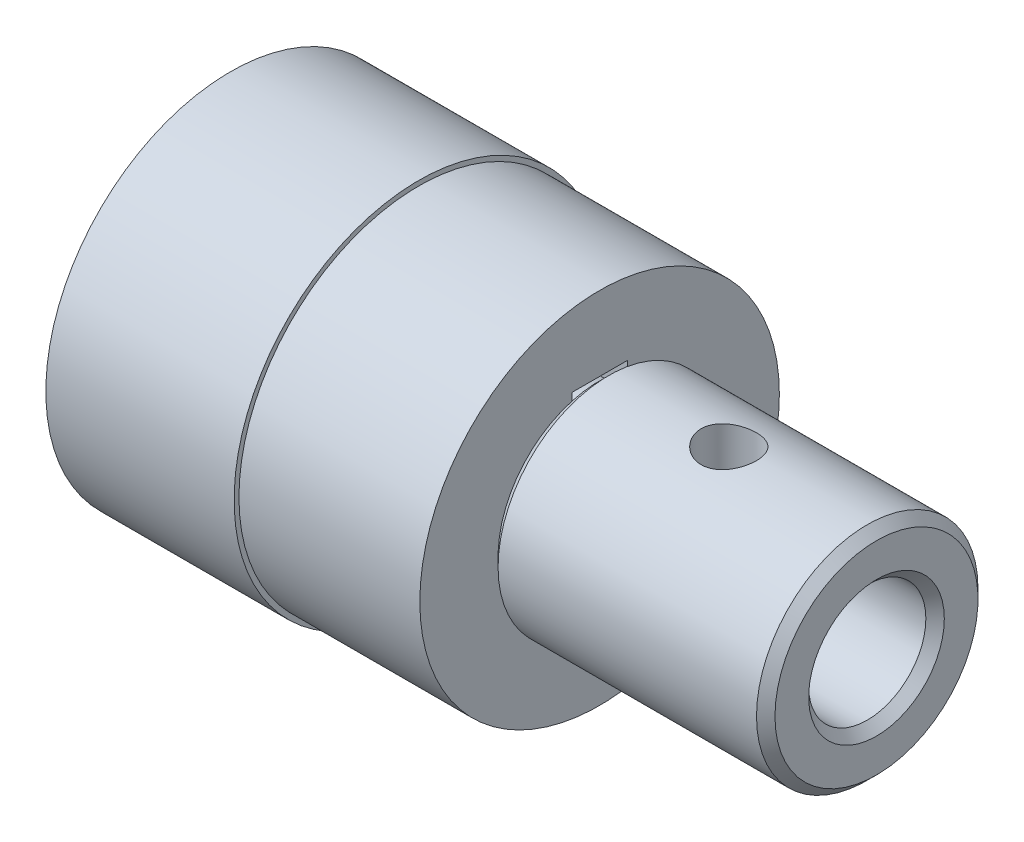
ISO-10303-21;
HEADER;
FILE_DESCRIPTION(('STEP AP214'),'2;1');
FILE_NAME('part.step','',(''),(''),'','','');
FILE_SCHEMA(('AUTOMOTIVE_DESIGN { 1 0 10303 214 1 1 1 1 }'));
ENDSEC;
DATA;
#1=APPLICATION_CONTEXT('core data for automotive mechanical design processes');
#2=APPLICATION_PROTOCOL_DEFINITION('international standard','automotive_design',2000,#1);
#3=PRODUCT_CONTEXT('',#1,'mechanical');
#4=PRODUCT('Part','Part','',(#3));
#5=PRODUCT_RELATED_PRODUCT_CATEGORY('part','',(#4));
#6=PRODUCT_DEFINITION_FORMATION('','',#4);
#7=PRODUCT_DEFINITION_CONTEXT('part definition',#1,'design');
#8=PRODUCT_DEFINITION('design','',#6,#7);
#9=PRODUCT_DEFINITION_SHAPE('','',#8);
#10=(LENGTH_UNIT() NAMED_UNIT(*) SI_UNIT(.MILLI.,.METRE.));
#11=(NAMED_UNIT(*) PLANE_ANGLE_UNIT() SI_UNIT($,.RADIAN.));
#12=(NAMED_UNIT(*) SI_UNIT($,.STERADIAN.) SOLID_ANGLE_UNIT());
#13=UNCERTAINTY_MEASURE_WITH_UNIT(LENGTH_MEASURE(1.E-05),#10,'distance_accuracy_value','');
#14=(GEOMETRIC_REPRESENTATION_CONTEXT(3) GLOBAL_UNCERTAINTY_ASSIGNED_CONTEXT((#13)) GLOBAL_UNIT_ASSIGNED_CONTEXT((#10,
#11,#12)) REPRESENTATION_CONTEXT('',''));
#15=CARTESIAN_POINT('',(0.,0.,0.));
#16=DIRECTION('',(0.,0.,1.));
#17=DIRECTION('',(1.,0.,0.));
#18=AXIS2_PLACEMENT_3D('',#15,#16,#17);
#19=CARTESIAN_POINT('',(-32.1530426464847,11.6343589680811,14.4976802298514));
#20=DIRECTION('',(1.,0.,0.));
#21=DIRECTION('',(0.,0.,-1.));
#22=AXIS2_PLACEMENT_3D('',#19,#20,#21);
#23=CONICAL_SURFACE('',#22,3.6750000000437,0.785398163397448);
#24=CARTESIAN_POINT('',(-32.6530426464571,11.6343589680811,14.4976802298514));
#25=DIRECTION('',(-1.,0.,0.));
#26=DIRECTION('',(0.,0.,1.));
#27=AXIS2_PLACEMENT_3D('',#24,#25,#26);
#28=CIRCLE('',#27,3.175);
#29=CARTESIAN_POINT('',(-32.6530426464571,11.6343589680811,17.6726802298514));
#30=VERTEX_POINT('',#29);
#31=EDGE_CURVE('E188',#30,#30,#28,.T.);
#32=ORIENTED_EDGE('',*,*,#31,.T.);
#33=EDGE_LOOP('',(#32));
#34=FACE_BOUND('',#33,.T.);
#35=CARTESIAN_POINT('',(-32.1530426464847,11.6343589680811,14.4976802298514));
#36=DIRECTION('',(1.,0.,0.));
#37=DIRECTION('',(0.,0.,-1.));
#38=AXIS2_PLACEMENT_3D('',#35,#36,#37);
#39=CIRCLE('',#38,3.6750000000437);
#40=CARTESIAN_POINT('',(-32.1530426464847,11.6343589680811,10.8226802298077));
#41=VERTEX_POINT('',#40);
#42=EDGE_CURVE('E20',#41,#41,#39,.T.);
#43=ORIENTED_EDGE('',*,*,#42,.T.);
#44=EDGE_LOOP('',(#43));
#45=FACE_BOUND('',#44,.T.);
#46=ADVANCED_FACE('F17',(#34,#45),#23,.F.);
#47=CARTESIAN_POINT('',(-50.1530426464463,11.6343589680811,14.4976802298514));
#48=DIRECTION('',(1.,0.,0.));
#49=DIRECTION('',(0.,0.,-1.));
#50=AXIS2_PLACEMENT_3D('',#47,#48,#49);
#51=CONICAL_SURFACE('',#50,3.17499999999357,1.04719755119662);
#52=CARTESIAN_POINT('',(-51.9861297511195,11.6343589680811,14.4976802298513));
#53=VERTEX_POINT('',#52);
#54=VERTEX_LOOP('',#53);
#55=FACE_BOUND('',#54,.T.);
#56=CARTESIAN_POINT('',(-50.1530426464571,11.6343589680811,14.4976802298514));
#57=DIRECTION('',(-1.,0.,0.));
#58=DIRECTION('',(0.,0.,1.));
#59=AXIS2_PLACEMENT_3D('',#56,#57,#58);
#60=CIRCLE('',#59,3.175);
#61=CARTESIAN_POINT('',(-50.1530426464571,11.6343589680811,17.6726802298514));
#62=VERTEX_POINT('',#61);
#63=EDGE_CURVE('E184',#62,#62,#60,.F.);
#64=ORIENTED_EDGE('',*,*,#63,.T.);
#65=EDGE_LOOP('',(#64));
#66=FACE_BOUND('',#65,.T.);
#67=ADVANCED_FACE('F279',(#55,#66),#51,.F.);
#68=CARTESIAN_POINT('',(-32.1530426464571,17.6343589680811,14.4976802298514));
#69=DIRECTION('',(-1.,0.,0.));
#70=DIRECTION('',(0.,0.,1.));
#71=AXIS2_PLACEMENT_3D('',#68,#69,#70);
#72=PLANE('',#71);
#73=ORIENTED_EDGE('',*,*,#42,.F.);
#74=EDGE_LOOP('',(#73));
#75=FACE_BOUND('',#74,.T.);
#76=CARTESIAN_POINT('',(-32.1530426464847,11.6343589680811,14.4976802298514));
#77=DIRECTION('',(-1.,0.,0.));
#78=DIRECTION('',(0.,0.,1.));
#79=AXIS2_PLACEMENT_3D('',#76,#77,#78);
#80=CIRCLE('',#79,5.49999999998377);
#81=CARTESIAN_POINT('',(-32.1530426464847,11.6343589680811,19.9976802298352));
#82=VERTEX_POINT('',#81);
#83=EDGE_CURVE('E187',#82,#82,#80,.T.);
#84=ORIENTED_EDGE('',*,*,#83,.F.);
#85=EDGE_LOOP('',(#84));
#86=FACE_BOUND('',#85,.T.);
#87=ADVANCED_FACE('F276',(#75,#86),#72,.F.);
#88=CARTESIAN_POINT('',(-104.589647703624,11.6343589680811,14.4976802298514));
#89=DIRECTION('',(-1.,0.,0.));
#90=DIRECTION('',(0.,0.,1.));
#91=AXIS2_PLACEMENT_3D('',#88,#89,#90);
#92=CYLINDRICAL_SURFACE('',#91,3.175);
#93=CARTESIAN_POINT('',(-38.6549989871894,14.8084352186503,14.421094269808));
#94=CARTESIAN_POINT('',(-38.6591005159779,14.8064978774693,14.3409506354571));
#95=CARTESIAN_POINT('',(-38.6696655257545,14.8015038648331,14.2610950891726));
#96=CARTESIAN_POINT('',(-38.7032621922794,14.7859096161153,14.1045140267677));
#97=CARTESIAN_POINT('',(-38.7263234491977,14.7752960702784,14.0277964094547));
#98=CARTESIAN_POINT('',(-38.7838502368912,14.749588558509,13.8799619146142));
#99=CARTESIAN_POINT('',(-38.8182683435264,14.7345132506148,13.8088232440998));
#100=CARTESIAN_POINT('',(-38.8973866682666,14.7012809005847,13.6733713434811));
#101=CARTESIAN_POINT('',(-38.9420850463091,14.6831244101011,13.6090568949182));
#102=CARTESIAN_POINT('',(-39.0436674742159,14.6441772311903,13.4847046564924));
#103=CARTESIAN_POINT('',(-39.1011288044887,14.6232933997664,13.4251675560727));
#104=CARTESIAN_POINT('',(-39.2251530792043,14.5819320572085,13.3162234125197));
#105=CARTESIAN_POINT('',(-39.2917217411498,14.5614548106466,13.2668227820645));
#106=CARTESIAN_POINT('',(-39.4362530196415,14.5221510786825,13.1771489585295));
#107=CARTESIAN_POINT('',(-39.5146223414325,14.5034610405408,13.1374659545164));
#108=CARTESIAN_POINT('',(-39.6780463909101,14.4715863975076,13.0721623581435));
#109=CARTESIAN_POINT('',(-39.7630945865788,14.4583964911802,13.0465282169185));
#110=CARTESIAN_POINT('',(-39.9303991354037,14.4403944248839,13.0120346677264));
#111=CARTESIAN_POINT('',(-40.012353814898,14.4350078413076,13.0020203491948));
#112=CARTESIAN_POINT('',(-40.1769291432068,14.4315795798184,12.995614768941));
#113=CARTESIAN_POINT('',(-40.2595494233553,14.4335340820411,12.9992164222834));
#114=CARTESIAN_POINT('',(-40.4151967361039,14.4439592594769,13.0188731136786));
#115=CARTESIAN_POINT('',(-40.4884159492386,14.451825076443,13.0337732687746));
#116=CARTESIAN_POINT('',(-40.6312145342669,14.4723641731839,13.0740026944023));
#117=CARTESIAN_POINT('',(-40.7007928480052,14.4850388418225,13.0993349780599));
#118=CARTESIAN_POINT('',(-40.8381898076123,14.5145188783892,13.1610707261204));
#119=CARTESIAN_POINT('',(-40.905752407054,14.5314971460858,13.1979586142299));
#120=CARTESIAN_POINT('',(-41.0341108446635,14.5674635304472,13.2812997833373));
#121=CARTESIAN_POINT('',(-41.0949032326061,14.5864526623563,13.3277579074493));
#122=CARTESIAN_POINT('',(-41.2149348308601,14.6267997508178,13.4348813698128));
#123=CARTESIAN_POINT('',(-41.2732765437025,14.6481895886624,13.4965449482816));
#124=CARTESIAN_POINT('',(-41.3790075900644,14.6890659803567,13.629229728679));
#125=CARTESIAN_POINT('',(-41.4263946878216,14.7085521452121,13.700252836188));
#126=CARTESIAN_POINT('',(-41.5093067834218,14.7438039537282,13.8511131946576));
#127=CARTESIAN_POINT('',(-41.5446640107069,14.7595161434431,13.9310559650998));
#128=CARTESIAN_POINT('',(-41.6010963744458,14.7850487190069,14.0967067510995));
#129=CARTESIAN_POINT('',(-41.6221827378035,14.794873735602,14.1824101762518));
#130=CARTESIAN_POINT('',(-41.6478507993788,14.8068914559952,14.3491967308256));
#131=CARTESIAN_POINT('',(-41.6536944133791,14.8096671665461,14.4300445446639));
#132=CARTESIAN_POINT('',(-41.6522758383527,14.8089964203368,14.5915882660705));
#133=CARTESIAN_POINT('',(-41.6450171172735,14.8055516100343,14.6722842081775));
#134=CARTESIAN_POINT('',(-41.6184783219149,14.7931563626178,14.8268047414644));
#135=CARTESIAN_POINT('',(-41.5998502975035,14.784504888835,14.9007675444428));
#136=CARTESIAN_POINT('',(-41.5518978239434,14.7627715550111,15.0444366220627));
#137=CARTESIAN_POINT('',(-41.5225716661199,14.7496889872724,15.1141422146777));
#138=CARTESIAN_POINT('',(-41.4525606869017,14.7195378134896,15.2509629105562));
#139=CARTESIAN_POINT('',(-41.4114064635594,14.7023106585071,15.3178019342678));
#140=CARTESIAN_POINT('',(-41.3195367242308,14.6657872306725,15.4439288706233));
#141=CARTESIAN_POINT('',(-41.2688161619877,14.6464898681102,15.5032127701456));
#142=CARTESIAN_POINT('',(-41.1539604298228,14.6057772736466,15.6180983149854));
#143=CARTESIAN_POINT('',(-41.0890312351334,14.5843269773784,15.6728965018758));
#144=CARTESIAN_POINT('',(-40.9504308806693,14.5433239016454,15.7710155277899));
#145=CARTESIAN_POINT('',(-40.8767572139133,14.5237716692774,15.8143330638249));
#146=CARTESIAN_POINT('',(-40.7212742538128,14.4887798661514,15.8885864528566));
#147=CARTESIAN_POINT('',(-40.6393754292018,14.4733942823954,15.9193621603412));
#148=CARTESIAN_POINT('',(-40.4705760506415,14.4494107373767,15.9662922643768));
#149=CARTESIAN_POINT('',(-40.3836818371903,14.440804367006,15.9824647787559));
#150=CARTESIAN_POINT('',(-40.2171683306427,14.4323140776418,15.998393466366));
#151=CARTESIAN_POINT('',(-40.1377357278039,14.4316139121696,15.9996861557157));
#152=CARTESIAN_POINT('',(-39.979891894367,14.4369269045302,15.9897490703616));
#153=CARTESIAN_POINT('',(-39.9014806037798,14.4429396662482,15.9785200345368));
#154=CARTESIAN_POINT('',(-39.7521760094669,14.460327834339,15.945040128467));
#155=CARTESIAN_POINT('',(-39.6811048811413,14.4713994407013,15.9234104326969));
#156=CARTESIAN_POINT('',(-39.5435498807631,14.497493228616,15.8702545152881));
#157=CARTESIAN_POINT('',(-39.477067464459,14.5125166566602,15.8387251704729));
#158=CARTESIAN_POINT('',(-39.3443760444262,14.5464199416952,15.7635258958078));
#159=CARTESIAN_POINT('',(-39.2786844492823,14.5655205756456,15.7190438119686));
#160=CARTESIAN_POINT('',(-39.1552545046407,14.6046744560347,15.6204728051755));
#161=CARTESIAN_POINT('',(-39.0975201887233,14.6247281787226,15.5663790415892));
#162=CARTESIAN_POINT('',(-38.9862049597683,14.6657306549654,15.4442152952555));
#163=CARTESIAN_POINT('',(-38.9334948320792,14.6865920149427,15.3753173475007));
#164=CARTESIAN_POINT('',(-38.8403830510482,14.7249733365776,15.2287462017809));
#165=CARTESIAN_POINT('',(-38.7999846049583,14.7424924271142,15.1510707244389));
#166=CARTESIAN_POINT('',(-38.7339664172932,14.7718021708286,14.9911449748772));
#167=CARTESIAN_POINT('',(-38.7079813552216,14.7837331051357,14.9090718982071));
#168=CARTESIAN_POINT('',(-38.6704531072388,14.801126013543,14.7411632175518));
#169=CARTESIAN_POINT('',(-38.658867964882,14.806606778739,14.6553393022275));
#170=CARTESIAN_POINT('',(-38.6535699949144,14.809110306159,14.5445533185568));
#171=CARTESIAN_POINT('',(-38.6530031328657,14.8093776591067,14.5198544559183));
#172=CARTESIAN_POINT('',(-38.6530864047722,14.8093382716761,14.4704593870767));
#173=CARTESIAN_POINT('',(-38.6537365007861,14.8090315491957,14.4457631808147));
#174=CARTESIAN_POINT('',(-38.6549989871894,14.8084352186503,14.421094269808));
#175=B_SPLINE_CURVE_WITH_KNOTS('',3,(#93,#94,#95,#96,#97,#98,#99,#100,#101,#102,#103,#104,#105,
#106,#107,#108,#109,#110,#111,#112,#113,#114,#115,#116,#117,#118,#119,#120,#121,#122,#123,#124,
#125,#126,#127,#128,#129,#130,#131,#132,#133,#134,#135,#136,#137,#138,#139,#140,#141,#142,#143,
#144,#145,#146,#147,#148,#149,#150,#151,#152,#153,#154,#155,#156,#157,#158,#159,#160,#161,#162,
#163,#164,#165,#166,#167,#168,#169,#170,#171,#172,#173,#174),.UNSPECIFIED.,.T.,.F.,(4,2,2,2,2,2,
2,2,2,2,2,2,2,2,2,2,2,2,2,2,2,2,2,2,2,2,2,2,2,2,2,2,2,2,2,2,2,2,2,2,4),(0.,0.240713732505742,
0.482000158089505,0.722291503819027,0.962539873301612,1.21745328406553,1.47252746792247,
1.74054192629373,2.00829745192118,2.25511690017669,2.50180793606968,2.72620443330612,
2.95066578879677,3.18619791611026,3.4218495309327,3.68328134757539,3.94476647365491,
4.20976166447295,4.47454814020199,4.71659444581155,4.95857669559962,5.18783742570462,
5.41713478870963,5.65721782530206,5.89742786202588,6.15912018691918,6.42088771929325,
6.68590023796929,6.95058350845511,7.18765576244872,7.42471402808016,7.6491019723254,
7.87356077852996,8.11736500360057,8.36129236312836,8.62766118885701,8.89409934574205,
9.15343355106802,9.41201036030146,9.48610646075629,9.56020025115374),.UNSPECIFIED.);
#176=CARTESIAN_POINT('',(-38.6549989871894,14.8084352186503,14.421094269808));
#177=VERTEX_POINT('',#176);
#178=EDGE_CURVE('E183',#177,#177,#175,.T.);
#179=ORIENTED_EDGE('',*,*,#178,.T.);
#180=EDGE_LOOP('',(#179));
#181=FACE_BOUND('',#180,.T.);
#182=ORIENTED_EDGE('',*,*,#63,.F.);
#183=EDGE_LOOP('',(#182));
#184=FACE_BOUND('',#183,.T.);
#185=ORIENTED_EDGE('',*,*,#31,.F.);
#186=EDGE_LOOP('',(#185));
#187=FACE_BOUND('',#186,.T.);
#188=ADVANCED_FACE('F271',(#181,#184,#187),#92,.F.);
#189=CARTESIAN_POINT('',(-32.6530426465297,11.6343589680811,14.4976802298514));
#190=DIRECTION('',(-1.,0.,0.));
#191=DIRECTION('',(0.,0.,1.));
#192=AXIS2_PLACEMENT_3D('',#189,#190,#191);
#193=CONICAL_SURFACE('',#192,5.99999999997195,0.785398163340605);
#194=ORIENTED_EDGE('',*,*,#83,.T.);
#195=EDGE_LOOP('',(#194));
#196=FACE_BOUND('',#195,.T.);
#197=CARTESIAN_POINT('',(-32.6530426464571,11.6343589680811,14.4976802298514));
#198=DIRECTION('',(-1.,0.,0.));
#199=DIRECTION('',(0.,0.,1.));
#200=AXIS2_PLACEMENT_3D('',#197,#198,#199);
#201=CIRCLE('',#200,6.);
#202=CARTESIAN_POINT('',(-32.6530426464571,11.6343589680811,20.4976802298514));
#203=VERTEX_POINT('',#202);
#204=EDGE_CURVE('E104',#203,#203,#201,.T.);
#205=ORIENTED_EDGE('',*,*,#204,.F.);
#206=EDGE_LOOP('',(#205));
#207=FACE_BOUND('',#206,.T.);
#208=ADVANCED_FACE('F267',(#196,#207),#193,.T.);
#209=CARTESIAN_POINT('',(-40.1530426464571,22.097209407696,14.4976802298514));
#210=DIRECTION('',(0.,1.,0.));
#211=DIRECTION('',(0.,0.,1.));
#212=AXIS2_PLACEMENT_3D('',#209,#210,#211);
#213=CYLINDRICAL_SURFACE('',#212,1.5);
#214=CARTESIAN_POINT('',(-41.6512008192683,17.6338987862916,14.4233692005007));
#215=CARTESIAN_POINT('',(-41.6470789750314,17.6328686901972,14.3403191579504));
#216=CARTESIAN_POINT('',(-41.6360325068122,17.6301037490662,14.257606664619));
#217=CARTESIAN_POINT('',(-41.6004498736642,17.6214029735418,14.0952797342422));
#218=CARTESIAN_POINT('',(-41.5759052289359,17.61546514595,14.0156672783969));
#219=CARTESIAN_POINT('',(-41.5141540500161,17.6010773262021,13.8618878059999));
#220=CARTESIAN_POINT('',(-41.4769639563414,17.5926305976957,13.7877138702075));
#221=CARTESIAN_POINT('',(-41.3910088132152,17.5741236236432,13.6466428876624));
#222=CARTESIAN_POINT('',(-41.3422435121978,17.5640633430312,13.5797459991092));
#223=CARTESIAN_POINT('',(-41.2334072482487,17.5431902551984,13.4537084797059));
#224=CARTESIAN_POINT('',(-41.1731369796986,17.5323666997946,13.3947416638978));
#225=CARTESIAN_POINT('',(-41.0435138885177,17.5113357722796,13.2876684758566));
#226=CARTESIAN_POINT('',(-40.97416033863,17.5011284496031,13.2395629740805));
#227=CARTESIAN_POINT('',(-40.8274687054758,17.4823942565379,13.1551534253695));
#228=CARTESIAN_POINT('',(-40.750059185061,17.4738847921719,13.1189693632115));
#229=CARTESIAN_POINT('',(-40.5899950777605,17.4596988458556,13.0602042826299));
#230=CARTESIAN_POINT('',(-40.5073414967459,17.4540218224511,13.037620664152));
#231=CARTESIAN_POINT('',(-40.3412440780425,17.4463040172219,13.0071978793984));
#232=CARTESIAN_POINT('',(-40.257866322155,17.4441795846904,12.9990192722569));
#233=CARTESIAN_POINT('',(-40.0909046742023,17.443566800685,12.9966448809555));
#234=CARTESIAN_POINT('',(-40.007320809786,17.445077985467,13.0024473134331));
#235=CARTESIAN_POINT('',(-39.8441079600277,17.4514819708748,13.0275648951258));
#236=CARTESIAN_POINT('',(-39.7644330623184,17.4563050490415,13.0466015365203));
#237=CARTESIAN_POINT('',(-39.6094262350064,17.4687006888259,13.0972760294053));
#238=CARTESIAN_POINT('',(-39.5340947341286,17.4762735213277,13.1289151224202));
#239=CARTESIAN_POINT('',(-39.3886058156001,17.4934594089904,13.2044445373243));
#240=CARTESIAN_POINT('',(-39.3185465511492,17.5031022337226,13.2485169365693));
#241=CARTESIAN_POINT('',(-39.1866844166594,17.5232972893501,13.3474845044486));
#242=CARTESIAN_POINT('',(-39.1248829710971,17.53384967663,13.4023815363026));
#243=CARTESIAN_POINT('',(-39.009549307146,17.5550236804547,13.5232136944017));
#244=CARTESIAN_POINT('',(-38.9562871642678,17.5656393977059,13.5894080465275));
#245=CARTESIAN_POINT('',(-38.8616037740558,17.5854651315524,13.7299784116402));
#246=CARTESIAN_POINT('',(-38.820182372634,17.5946751664397,13.8043543181398));
#247=CARTESIAN_POINT('',(-38.7505126423565,17.6106402744828,13.9590807882736));
#248=CARTESIAN_POINT('',(-38.722233142424,17.6174011482735,14.0394166846917));
#249=CARTESIAN_POINT('',(-38.6796422933726,17.6277283914234,14.203903146382));
#250=CARTESIAN_POINT('',(-38.665328188876,17.6312953909238,14.2880529557379));
#251=CARTESIAN_POINT('',(-38.6513552691251,17.6347773892423,14.4553515056534));
#252=CARTESIAN_POINT('',(-38.6513129978968,17.6347879427265,14.5384663882464));
#253=CARTESIAN_POINT('',(-38.664924456379,17.631395979979,14.7034907094543));
#254=CARTESIAN_POINT('',(-38.678577397589,17.6279936602432,14.7854002171931));
#255=CARTESIAN_POINT('',(-38.7189165387925,17.6181991164604,14.944873133928));
#256=CARTESIAN_POINT('',(-38.7454716702649,17.6118369870544,15.0224716846928));
#257=CARTESIAN_POINT('',(-38.8107385913965,17.5968061033777,15.1721332509316));
#258=CARTESIAN_POINT('',(-38.8494518810098,17.5881370645233,15.2441955820352));
#259=CARTESIAN_POINT('',(-38.9388995252345,17.5691881611444,15.3824279265067));
#260=CARTESIAN_POINT('',(-38.9898740177045,17.5588777213255,15.4484383085284));
#261=CARTESIAN_POINT('',(-39.1020045749881,17.5378878692131,15.5710982031327));
#262=CARTESIAN_POINT('',(-39.1631622718264,17.5272083979942,15.6277462123378));
#263=CARTESIAN_POINT('',(-39.2955163439691,17.5064111458669,15.7313172195041));
#264=CARTESIAN_POINT('',(-39.3669016174893,17.4963105627102,15.7780027448888));
#265=CARTESIAN_POINT('',(-39.5167462278312,17.4781037772002,15.8586967138941));
#266=CARTESIAN_POINT('',(-39.5952049024763,17.4699973884246,15.8927063426422));
#267=CARTESIAN_POINT('',(-39.7560477785559,17.4568380742884,15.9466470319859));
#268=CARTESIAN_POINT('',(-39.8383755038831,17.4517506289568,15.9667377116026));
#269=CARTESIAN_POINT('',(-40.0053711530113,17.4451123461003,15.9927824919296));
#270=CARTESIAN_POINT('',(-40.0900385944489,17.4435607850313,15.9987394848113));
#271=CARTESIAN_POINT('',(-40.2567648748171,17.4441783064535,15.9963455565445));
#272=CARTESIAN_POINT('',(-40.3388301226605,17.4462439988624,15.9883922345355));
#273=CARTESIAN_POINT('',(-40.5004084943898,17.4536498231048,15.9592127158896));
#274=CARTESIAN_POINT('',(-40.5799215773607,17.4589900074058,15.9379863065768));
#275=CARTESIAN_POINT('',(-40.7342193612789,17.4723252459719,15.8829402584298));
#276=CARTESIAN_POINT('',(-40.8090036789173,17.480320515128,15.8491196002459));
#277=CARTESIAN_POINT('',(-40.951918141333,17.4980750136825,15.7698739663249));
#278=CARTESIAN_POINT('',(-41.0200472779226,17.5078345097056,15.7244472361512));
#279=CARTESIAN_POINT('',(-41.1497555626388,17.5283572259806,15.6217773383088));
#280=CARTESIAN_POINT('',(-41.2110979507355,17.5391408967327,15.5642389722642));
#281=CARTESIAN_POINT('',(-41.323370270283,17.5602866745732,15.4396805545331));
#282=CARTESIAN_POINT('',(-41.3742980253766,17.5706486931868,15.3726585259763));
#283=CARTESIAN_POINT('',(-41.4649189211517,17.5899469541607,15.2299496551477));
#284=CARTESIAN_POINT('',(-41.5044555446269,17.59886265905,15.1541604736567));
#285=CARTESIAN_POINT('',(-41.5701380165902,17.6140856019,14.9967786216405));
#286=CARTESIAN_POINT('',(-41.5962940671406,17.6203948264718,14.9151904268156));
#287=CARTESIAN_POINT('',(-41.6305989157262,17.6287697129246,14.7651265165962));
#288=CARTESIAN_POINT('',(-41.6412878063633,17.6314282712662,14.6972533106504));
#289=CARTESIAN_POINT('',(-41.6532887581812,17.634417657906,14.5606331848449));
#290=CARTESIAN_POINT('',(-41.6546013820595,17.6347486258897,14.4918863176642));
#291=CARTESIAN_POINT('',(-41.6512008192683,17.6338987862916,14.4233692005007));
#292=B_SPLINE_CURVE_WITH_KNOTS('',3,(#214,#215,#216,#217,#218,#219,#220,#221,#222,#223,#224,
#225,#226,#227,#228,#229,#230,#231,#232,#233,#234,#235,#236,#237,#238,#239,#240,#241,#242,#243,
#244,#245,#246,#247,#248,#249,#250,#251,#252,#253,#254,#255,#256,#257,#258,#259,#260,#261,#262,
#263,#264,#265,#266,#267,#268,#269,#270,#271,#272,#273,#274,#275,#276,#277,#278,#279,#280,#281,
#282,#283,#284,#285,#286,#287,#288,#289,#290,#291),.UNSPECIFIED.,.T.,.F.,(4,2,2,2,2,2,2,2,2,2,2,
2,2,2,2,2,2,2,2,2,2,2,2,2,2,2,2,2,2,2,2,2,2,2,2,2,2,2,4),(0.,0.249223080827562,
0.498602907265482,0.747659743558241,0.996721993140729,1.25057188224418,1.50444210838995,
1.76079449468266,2.01709785743554,2.26727653675833,2.5174233060335,2.76245919167327,
3.00751922287431,3.25637300123461,3.50526965168736,3.76092407650618,4.01657517424693,
4.27161676256507,4.52660802090339,4.77474760736801,5.02287290804171,5.26852869208607,
5.5142147946417,5.76517319044571,6.01617184520817,6.2726123259396,6.52902882486498,
6.78245383372208,7.03582697983366,7.28207579901057,7.52832856395742,7.77460126437598,
8.020911214761,8.2741165868803,8.52737481765308,8.7839629001289,9.04035505348866,
9.24597893227987,9.45159047087184),.UNSPECIFIED.);
#293=CARTESIAN_POINT('',(-41.6512008192683,17.6338987862916,14.4233692005007));
#294=VERTEX_POINT('',#293);
#295=EDGE_CURVE('E173',#294,#294,#292,.T.);
#296=ORIENTED_EDGE('',*,*,#295,.F.);
#297=EDGE_LOOP('',(#296));
#298=FACE_BOUND('',#297,.T.);
#299=ORIENTED_EDGE('',*,*,#178,.F.);
#300=EDGE_LOOP('',(#299));
#301=FACE_BOUND('',#300,.T.);
#302=ADVANCED_FACE('F263',(#298,#301),#213,.F.);
#303=CARTESIAN_POINT('',(-54.1530426464571,14.3343589680811,14.4976802298514));
#304=DIRECTION('',(0.,1.,0.));
#305=DIRECTION('',(0.,0.,1.));
#306=AXIS2_PLACEMENT_3D('',#303,#304,#305);
#307=CYLINDRICAL_SURFACE('',#306,1.5);
#308=CARTESIAN_POINT('',(-54.1530426464571,14.3343589680811,14.4976802298514));
#309=DIRECTION('',(0.,1.,0.));
#310=DIRECTION('',(0.,0.,1.));
#311=AXIS2_PLACEMENT_3D('',#308,#309,#310);
#312=CIRCLE('',#311,1.5);
#313=CARTESIAN_POINT('',(-54.1530426464571,14.3343589680811,15.9976802298514));
#314=VERTEX_POINT('',#313);
#315=CARTESIAN_POINT('',(-54.1530426464571,14.3343589680811,12.9976802298514));
#316=VERTEX_POINT('',#315);
#317=EDGE_CURVE('E212',#314,#316,#312,.T.);
#318=ORIENTED_EDGE('',*,*,#317,.F.);
#319=DIRECTION('',(0.,1.,0.));
#320=VECTOR('',#319,1.);
#321=CARTESIAN_POINT('',(-54.1530426464571,14.3343589680811,15.9976802298514));
#322=LINE('',#321,#320);
#323=CARTESIAN_POINT('',(-54.1530426464571,15.8769996552004,15.9976802298514));
#324=VERTEX_POINT('',#323);
#325=EDGE_CURVE('E181',#324,#314,#322,.F.);
#326=ORIENTED_EDGE('',*,*,#325,.F.);
#327=CARTESIAN_POINT('',(-54.1530426464571,15.8769996552004,12.9976802298514));
#328=CARTESIAN_POINT('',(-54.1121069012554,15.8769955994962,12.9976791086626));
#329=CARTESIAN_POINT('',(-54.0711920531731,15.8775928672298,12.9993570429703));
#330=CARTESIAN_POINT('',(-53.9896797703748,15.8799488774194,13.0060418192968));
#331=CARTESIAN_POINT('',(-53.9490822529676,15.8817073063429,13.0110477627011));
#332=CARTESIAN_POINT('',(-53.8284544316644,15.8886453514509,13.0309642170052));
#333=CARTESIAN_POINT('',(-53.7492713770514,15.8954883555738,13.0507738803092));
#334=CARTESIAN_POINT('',(-53.5956048577914,15.912780088564,13.1027426121058));
#335=CARTESIAN_POINT('',(-53.5211188261477,15.923226827375,13.1348948658701));
#336=CARTESIAN_POINT('',(-53.3785328954489,15.946540776373,13.2105703864041));
#337=CARTESIAN_POINT('',(-53.3104369528561,15.9594094715027,13.2541006356173));
#338=CARTESIAN_POINT('',(-53.1799622994703,15.9866761741118,13.3531031395669));
#339=CARTESIAN_POINT('',(-53.1178703257632,16.0011121346057,13.4089427593683));
#340=CARTESIAN_POINT('',(-53.0037336197696,16.0295666984758,13.5301975653642));
#341=CARTESIAN_POINT('',(-52.9516906765732,16.0435852271589,13.5956144530196));
#342=CARTESIAN_POINT('',(-52.8578233682508,16.0700672129945,13.736274760917));
#343=CARTESIAN_POINT('',(-52.8163011698537,16.0824805315089,13.8117300958137));
#344=CARTESIAN_POINT('',(-52.7466542689262,16.103903097151,13.9690363549026));
#345=CARTESIAN_POINT('',(-52.7185254737264,16.1129133839807,14.0508853164613));
#346=CARTESIAN_POINT('',(-52.67743905732,16.1262450352249,14.2156362116343));
#347=CARTESIAN_POINT('',(-52.6639877376266,16.1307186029097,14.2984024781612));
#348=CARTESIAN_POINT('',(-52.6510681986687,16.1350130941384,14.4651317756679));
#349=CARTESIAN_POINT('',(-52.6515966475525,16.1348351263006,14.5490945167195));
#350=CARTESIAN_POINT('',(-52.6663090711171,16.1299495476101,14.7123359977705));
#351=CARTESIAN_POINT('',(-52.6799566033963,16.1254198829501,14.7916692837897));
#352=CARTESIAN_POINT('',(-52.7196324444683,16.1125633755935,14.9468463264164));
#353=CARTESIAN_POINT('',(-52.7456614397665,16.1042363223471,15.0226898892761));
#354=CARTESIAN_POINT('',(-52.809674700858,16.0844939921507,15.1699091643978));
#355=CARTESIAN_POINT('',(-52.8478117141406,16.0730395356558,15.2412129883324));
#356=CARTESIAN_POINT('',(-52.9348325735431,16.0482347832818,15.3765671134976));
#357=CARTESIAN_POINT('',(-52.9837193430269,16.034883972045,15.4406154344234));
#358=CARTESIAN_POINT('',(-53.0935492214524,16.0069530472222,15.5628262394182));
#359=CARTESIAN_POINT('',(-53.1549509618717,15.9923446482798,15.6205706472704));
#360=CARTESIAN_POINT('',(-53.2867048810313,15.9640713251739,15.725088267082));
#361=CARTESIAN_POINT('',(-53.357059940062,15.9504067068174,15.7718579346271));
#362=CARTESIAN_POINT('',(-53.506062913987,15.9254094387259,15.8536852182406));
#363=CARTESIAN_POINT('',(-53.5848179188565,15.9141141923046,15.8885597441129));
#364=CARTESIAN_POINT('',(-53.747513112842,15.8955754240117,15.9443705759031));
#365=CARTESIAN_POINT('',(-53.8314448865153,15.888325509216,15.9653288839344));
#366=CARTESIAN_POINT('',(-53.9556706015791,15.8814070995019,15.9851674642726));
#367=CARTESIAN_POINT('',(-53.9950047312385,15.8797589835001,15.9898578217341));
#368=CARTESIAN_POINT('',(-54.0738997640568,15.8775545216521,15.9961121539582));
#369=CARTESIAN_POINT('',(-54.1134603082737,15.876996767024,15.9976801629439));
#370=CARTESIAN_POINT('',(-54.1530426464571,15.8769996552004,15.9976802298514));
#371=B_SPLINE_CURVE_WITH_KNOTS('',3,(#327,#328,#329,#330,#331,#332,#333,#334,#335,#336,#337,
#338,#339,#340,#341,#342,#343,#344,#345,#346,#347,#348,#349,#350,#351,#352,#353,#354,#355,#356,
#357,#358,#359,#360,#361,#362,#363,#364,#365,#366,#367,#368,#369,#370),.UNSPECIFIED.,.F.,.F.,(4,
2,2,2,2,2,2,2,2,2,2,2,2,2,2,2,2,2,2,2,2,4),(0.,0.122727727103147,0.245422329254189,
0.48987179759306,0.734186491449365,0.978651469702968,1.23174757444016,1.48488869795621,
1.74463699399652,2.00430586681691,2.25494206091104,2.50551852045963,2.74626627698603,
2.98702738362372,3.23095528238951,3.47494959883153,3.73041081087075,3.98595441373864,
4.2452704489206,4.50417551230259,4.62299842999128,4.74166772293585),.UNSPECIFIED.);
#372=CARTESIAN_POINT('',(-54.1530426464571,15.8769996552004,12.9976802298514));
#373=VERTEX_POINT('',#372);
#374=EDGE_CURVE('E113',#373,#324,#371,.T.);
#375=ORIENTED_EDGE('',*,*,#374,.F.);
#376=DIRECTION('',(0.,1.,0.));
#377=VECTOR('',#376,1.);
#378=CARTESIAN_POINT('',(-54.1530426464571,14.3343589680811,12.9976802298514));
#379=LINE('',#378,#377);
#380=EDGE_CURVE('E179',#316,#373,#379,.T.);
#381=ORIENTED_EDGE('',*,*,#380,.F.);
#382=EDGE_LOOP('',(#318,#326,#375,#381));
#383=FACE_BOUND('',#382,.T.);
#384=ADVANCED_FACE('F230',(#383),#307,.F.);
#385=CARTESIAN_POINT('',(-63.1530426464571,14.3343589680811,14.4976802298514));
#386=DIRECTION('',(0.,1.,0.));
#387=DIRECTION('',(0.,0.,1.));
#388=AXIS2_PLACEMENT_3D('',#385,#386,#387);
#389=CYLINDRICAL_SURFACE('',#388,1.5);
#390=CARTESIAN_POINT('',(-63.1530426464571,14.3343589680811,14.4976802298514));
#391=DIRECTION('',(0.,1.,0.));
#392=DIRECTION('',(0.,0.,1.));
#393=AXIS2_PLACEMENT_3D('',#390,#391,#392);
#394=CIRCLE('',#393,1.5);
#395=CARTESIAN_POINT('',(-63.1530426464571,14.3343589680811,12.9976802298514));
#396=VERTEX_POINT('',#395);
#397=CARTESIAN_POINT('',(-63.1530426464571,14.3343589680811,15.9976802298514));
#398=VERTEX_POINT('',#397);
#399=EDGE_CURVE('E134',#396,#398,#394,.T.);
#400=ORIENTED_EDGE('',*,*,#399,.F.);
#401=DIRECTION('',(0.,1.,0.));
#402=VECTOR('',#401,1.);
#403=CARTESIAN_POINT('',(-63.1530426464571,14.3343589680811,12.9976802298514));
#404=LINE('',#403,#402);
#405=CARTESIAN_POINT('',(-63.1530426464571,15.8769996552004,12.9976802298514));
#406=VERTEX_POINT('',#405);
#407=EDGE_CURVE('E105',#406,#396,#404,.F.);
#408=ORIENTED_EDGE('',*,*,#407,.F.);
#409=CARTESIAN_POINT('',(-63.1530426464571,15.8769996552004,15.9976802298514));
#410=CARTESIAN_POINT('',(-63.1939783916588,15.8769955994962,15.9976813510402));
#411=CARTESIAN_POINT('',(-63.2348932397411,15.8775928672298,15.9960034167325));
#412=CARTESIAN_POINT('',(-63.3164055225394,15.8799488774194,15.989318640406));
#413=CARTESIAN_POINT('',(-63.3570030399466,15.8817073063429,15.9843126970017));
#414=CARTESIAN_POINT('',(-63.4776308612498,15.8886453514509,15.9643962426976));
#415=CARTESIAN_POINT('',(-63.5568139158628,15.8954883555738,15.9445865793936));
#416=CARTESIAN_POINT('',(-63.7104804351228,15.912780088564,15.892617847597));
#417=CARTESIAN_POINT('',(-63.7849664667665,15.923226827375,15.8604655938327));
#418=CARTESIAN_POINT('',(-63.9275523974653,15.946540776373,15.7847900732987));
#419=CARTESIAN_POINT('',(-63.9956483400581,15.9594094715027,15.7412598240855));
#420=CARTESIAN_POINT('',(-64.1261229934439,15.9866761741118,15.6422573201359));
#421=CARTESIAN_POINT('',(-64.188214967151,16.0011121346057,15.5864177003345));
#422=CARTESIAN_POINT('',(-64.3023516731446,16.0295666984758,15.4651628943386));
#423=CARTESIAN_POINT('',(-64.354394616341,16.0435852271589,15.3997460066832));
#424=CARTESIAN_POINT('',(-64.4482619246634,16.0700672129945,15.2590856987858));
#425=CARTESIAN_POINT('',(-64.4897841230605,16.0824805315089,15.1836303638892));
#426=CARTESIAN_POINT('',(-64.559431023988,16.103903097151,15.0263241048002));
#427=CARTESIAN_POINT('',(-64.5875598191877,16.1129133839807,14.9444751432415));
#428=CARTESIAN_POINT('',(-64.6286462355942,16.1262450352249,14.7797242480685));
#429=CARTESIAN_POINT('',(-64.6420975552876,16.1307186029097,14.6969579815416));
#430=CARTESIAN_POINT('',(-64.6550170942455,16.1350130941384,14.5302286840349));
#431=CARTESIAN_POINT('',(-64.6544886453617,16.1348351263006,14.4462659429833));
#432=CARTESIAN_POINT('',(-64.6397762217971,16.1299495476101,14.2830244619323));
#433=CARTESIAN_POINT('',(-64.6261286895179,16.1254198829501,14.2036911759131));
#434=CARTESIAN_POINT('',(-64.5864528484459,16.1125633755935,14.0485141332864));
#435=CARTESIAN_POINT('',(-64.5604238531477,16.1042363223471,13.9726705704267));
#436=CARTESIAN_POINT('',(-64.4964105920562,16.0844939921507,13.825451295305));
#437=CARTESIAN_POINT('',(-64.4582735787736,16.0730395356558,13.7541474713704));
#438=CARTESIAN_POINT('',(-64.3712527193711,16.0482347832818,13.6187933462052));
#439=CARTESIAN_POINT('',(-64.3223659498873,16.034883972045,13.5547450252794));
#440=CARTESIAN_POINT('',(-64.2125360714618,16.0069530472222,13.4325342202846));
#441=CARTESIAN_POINT('',(-64.1511343310426,15.9923446482798,13.3747898124324));
#442=CARTESIAN_POINT('',(-64.0193804118829,15.9640713251739,13.2702721926208));
#443=CARTESIAN_POINT('',(-63.9490253528523,15.9504067068174,13.2235025250757));
#444=CARTESIAN_POINT('',(-63.8000223789272,15.9254094387259,13.1416752414622));
#445=CARTESIAN_POINT('',(-63.7212673740577,15.9141141923046,13.1068007155899));
#446=CARTESIAN_POINT('',(-63.5585721800722,15.8955754240117,13.0509898837997));
#447=CARTESIAN_POINT('',(-63.4746404063989,15.888325509216,13.0300315757684));
#448=CARTESIAN_POINT('',(-63.3504146913351,15.8814070995019,13.0101929954302));
#449=CARTESIAN_POINT('',(-63.3110805616758,15.8797589835001,13.0055026379687));
#450=CARTESIAN_POINT('',(-63.2321855288574,15.8775545216521,12.9992483057446));
#451=CARTESIAN_POINT('',(-63.1926249846405,15.876996767024,12.9976802967589));
#452=CARTESIAN_POINT('',(-63.1530426464571,15.8769996552004,12.9976802298514));
#453=B_SPLINE_CURVE_WITH_KNOTS('',3,(#409,#410,#411,#412,#413,#414,#415,#416,#417,#418,#419,
#420,#421,#422,#423,#424,#425,#426,#427,#428,#429,#430,#431,#432,#433,#434,#435,#436,#437,#438,
#439,#440,#441,#442,#443,#444,#445,#446,#447,#448,#449,#450,#451,#452),.UNSPECIFIED.,.F.,.F.,(4,
2,2,2,2,2,2,2,2,2,2,2,2,2,2,2,2,2,2,2,2,4),(0.,0.122727727103133,0.245422329254189,
0.489871797593053,0.734186491449334,0.978651469702953,1.23174757444015,1.4848886979562,
1.7446369939965,2.0043058668169,2.25494206091103,2.50551852045963,2.74626627698602,
2.98702738362371,3.23095528238951,3.47494959883152,3.73041081087075,3.98595441373863,
4.24527044892059,4.50417551230259,4.62299842999128,4.74166772293585),.UNSPECIFIED.);
#454=CARTESIAN_POINT('',(-63.1530426464571,15.8769996552004,15.9976802298514));
#455=VERTEX_POINT('',#454);
#456=EDGE_CURVE('E109',#455,#406,#453,.T.);
#457=ORIENTED_EDGE('',*,*,#456,.F.);
#458=DIRECTION('',(0.,1.,0.));
#459=VECTOR('',#458,1.);
#460=CARTESIAN_POINT('',(-63.1530426464571,14.3343589680811,15.9976802298514));
#461=LINE('',#460,#459);
#462=EDGE_CURVE('E92',#398,#455,#461,.T.);
#463=ORIENTED_EDGE('',*,*,#462,.F.);
#464=EDGE_LOOP('',(#400,#408,#457,#463));
#465=FACE_BOUND('',#464,.T.);
#466=ADVANCED_FACE('F110',(#465),#389,.F.);
#467=CARTESIAN_POINT('',(-104.589647703624,11.6343589680811,14.4976802298514));
#468=DIRECTION('',(-1.,0.,0.));
#469=DIRECTION('',(0.,0.,1.));
#470=AXIS2_PLACEMENT_3D('',#467,#468,#469);
#471=CYLINDRICAL_SURFACE('',#470,6.);
#472=ORIENTED_EDGE('',*,*,#295,.T.);
#473=EDGE_LOOP('',(#472));
#474=FACE_BOUND('',#473,.T.);
#475=CARTESIAN_POINT('',(-46.653042646426,11.6343589680811,14.4976802298514));
#476=DIRECTION('',(1.,0.,0.));
#477=DIRECTION('',(0.,0.,-1.));
#478=AXIS2_PLACEMENT_3D('',#475,#476,#477);
#479=CIRCLE('',#478,5.99999999997167);
#480=CARTESIAN_POINT('',(-46.653042646426,11.6343589680811,8.49768022987973));
#481=VERTEX_POINT('',#480);
#482=EDGE_CURVE('E130',#481,#481,#479,.F.);
#483=ORIENTED_EDGE('',*,*,#482,.F.);
#484=EDGE_LOOP('',(#483));
#485=FACE_BOUND('',#484,.T.);
#486=ORIENTED_EDGE('',*,*,#204,.T.);
#487=EDGE_LOOP('',(#486));
#488=FACE_BOUND('',#487,.T.);
#489=ADVANCED_FACE('F250',(#474,#485,#488),#471,.T.);
#490=CARTESIAN_POINT('',(-47.1530426464571,16.1343589680811,14.4976802298514));
#491=DIRECTION('',(1.,0.,0.));
#492=DIRECTION('',(0.,0.,-1.));
#493=AXIS2_PLACEMENT_3D('',#490,#491,#492);
#494=PLANE('',#493);
#495=DIRECTION('',(0.,1.,0.));
#496=VECTOR('',#495,1.);
#497=CARTESIAN_POINT('',(-47.1530426464571,16.1343589680811,12.9976802298514));
#498=LINE('',#497,#496);
#499=CARTESIAN_POINT('',(-47.1530426464571,15.8769996552004,12.9976802298514));
#500=VERTEX_POINT('',#499);
#501=CARTESIAN_POINT('',(-47.1530426464356,16.9258615902017,12.9976802298514));
#502=VERTEX_POINT('',#501);
#503=EDGE_CURVE('E114',#500,#502,#498,.T.);
#504=ORIENTED_EDGE('',*,*,#503,.F.);
#505=CARTESIAN_POINT('',(-47.1530426464571,11.6343589680811,14.4976802298514));
#506=DIRECTION('',(-1.,0.,0.));
#507=DIRECTION('',(0.,0.,1.));
#508=AXIS2_PLACEMENT_3D('',#505,#506,#507);
#509=CIRCLE('',#508,4.5);
#510=CARTESIAN_POINT('',(-47.1530426464571,15.8769996552004,15.9976802298514));
#511=VERTEX_POINT('',#510);
#512=EDGE_CURVE('E215',#511,#500,#509,.T.);
#513=ORIENTED_EDGE('',*,*,#512,.F.);
#514=DIRECTION('',(0.,1.,0.));
#515=VECTOR('',#514,1.);
#516=CARTESIAN_POINT('',(-47.1530426464571,16.1343589680811,15.9976802298514));
#517=LINE('',#516,#515);
#518=CARTESIAN_POINT('',(-47.1530426464356,16.9258615902017,15.9976802298514));
#519=VERTEX_POINT('',#518);
#520=EDGE_CURVE('E171',#519,#511,#517,.F.);
#521=ORIENTED_EDGE('',*,*,#520,.F.);
#522=CARTESIAN_POINT('',(-47.1530426464142,11.6343589680811,14.4976802298514));
#523=DIRECTION('',(1.,0.,0.));
#524=DIRECTION('',(0.,0.,-1.));
#525=AXIS2_PLACEMENT_3D('',#522,#523,#524);
#526=CIRCLE('',#525,5.49999999998349);
#527=EDGE_CURVE('E133',#502,#519,#526,.T.);
#528=ORIENTED_EDGE('',*,*,#527,.F.);
#529=EDGE_LOOP('',(#504,#513,#521,#528));
#530=FACE_BOUND('',#529,.T.);
#531=ADVANCED_FACE('F246',(#530),#494,.F.);
#532=CARTESIAN_POINT('',(-66.1530426464571,11.6343589680811,14.4976802298514));
#533=DIRECTION('',(1.,0.,0.));
#534=DIRECTION('',(0.,0.,-1.));
#535=AXIS2_PLACEMENT_3D('',#532,#533,#534);
#536=PLANE('',#535);
#537=CARTESIAN_POINT('',(-66.1530426464765,11.6343589680811,14.4976802298514));
#538=DIRECTION('',(1.,0.,0.));
#539=DIRECTION('',(0.,0.,-1.));
#540=AXIS2_PLACEMENT_3D('',#537,#538,#539);
#541=CIRCLE('',#540,3.99999999996212);
#542=CARTESIAN_POINT('',(-66.1530426464765,11.6343589680811,10.4976802298893));
#543=VERTEX_POINT('',#542);
#544=EDGE_CURVE('E169',#543,#543,#541,.T.);
#545=ORIENTED_EDGE('',*,*,#544,.F.);
#546=EDGE_LOOP('',(#545));
#547=FACE_BOUND('',#546,.T.);
#548=ADVANCED_FACE('F243',(#547),#536,.F.);
#549=CARTESIAN_POINT('',(-104.589647703624,11.6343589680811,14.4976802298514));
#550=DIRECTION('',(-1.,0.,0.));
#551=DIRECTION('',(0.,0.,1.));
#552=AXIS2_PLACEMENT_3D('',#549,#550,#551);
#553=CYLINDRICAL_SURFACE('',#552,4.5);
#554=DIRECTION('',(1.,0.,0.));
#555=VECTOR('',#554,1.);
#556=CARTESIAN_POINT('',(-54.1530426464571,15.8769996552004,15.9976802298514));
#557=LINE('',#556,#555);
#558=CARTESIAN_POINT('',(-65.6530426464675,15.8769996551887,15.9976802298473));
#559=VERTEX_POINT('',#558);
#560=EDGE_CURVE('E97',#559,#455,#557,.T.);
#561=ORIENTED_EDGE('',*,*,#560,.T.);
#562=ORIENTED_EDGE('',*,*,#456,.T.);
#563=DIRECTION('',(-1.,0.,0.));
#564=VECTOR('',#563,1.);
#565=CARTESIAN_POINT('',(-54.1530426464571,15.8769996552004,12.9976802298514));
#566=LINE('',#565,#564);
#567=CARTESIAN_POINT('',(-65.6530426464649,15.8769996551887,12.9976802298555));
#568=VERTEX_POINT('',#567);
#569=EDGE_CURVE('E121',#406,#568,#566,.T.);
#570=ORIENTED_EDGE('',*,*,#569,.T.);
#571=CARTESIAN_POINT('',(-65.6530426464883,11.6343589680811,14.4976802298514));
#572=DIRECTION('',(1.,0.,0.));
#573=DIRECTION('',(0.,0.,-1.));
#574=AXIS2_PLACEMENT_3D('',#571,#572,#573);
#575=CIRCLE('',#574,4.49999999995029);
#576=EDGE_CURVE('E118',#559,#568,#575,.F.);
#577=ORIENTED_EDGE('',*,*,#576,.F.);
#578=EDGE_LOOP('',(#561,#562,#570,#577));
#579=FACE_BOUND('',#578,.T.);
#580=ADVANCED_FACE('F116',(#579),#553,.T.);
#581=CARTESIAN_POINT('',(-104.589647703624,11.6343589680811,14.4976802298514));
#582=DIRECTION('',(-1.,0.,0.));
#583=DIRECTION('',(0.,0.,1.));
#584=AXIS2_PLACEMENT_3D('',#581,#582,#583);
#585=CYLINDRICAL_SURFACE('',#584,4.5);
#586=DIRECTION('',(1.,0.,0.));
#587=VECTOR('',#586,1.);
#588=CARTESIAN_POINT('',(-54.1530426464571,15.8769996552004,15.9976802298514));
#589=LINE('',#588,#587);
#590=EDGE_CURVE('E123',#324,#511,#589,.T.);
#591=ORIENTED_EDGE('',*,*,#590,.T.);
#592=ORIENTED_EDGE('',*,*,#512,.T.);
#593=DIRECTION('',(-1.,0.,0.));
#594=VECTOR('',#593,1.);
#595=CARTESIAN_POINT('',(-54.1530426464571,15.8769996552004,12.9976802298514));
#596=LINE('',#595,#594);
#597=EDGE_CURVE('E158',#500,#373,#596,.T.);
#598=ORIENTED_EDGE('',*,*,#597,.T.);
#599=ORIENTED_EDGE('',*,*,#374,.T.);
#600=EDGE_LOOP('',(#591,#592,#598,#599));
#601=FACE_BOUND('',#600,.T.);
#602=ADVANCED_FACE('F233',(#601),#585,.T.);
#603=CARTESIAN_POINT('',(-54.1530426464571,14.3343589680811,14.4976802298514));
#604=DIRECTION('',(0.,1.,0.));
#605=DIRECTION('',(0.,0.,1.));
#606=AXIS2_PLACEMENT_3D('',#603,#604,#605);
#607=PLANE('',#606);
#608=ORIENTED_EDGE('',*,*,#399,.T.);
#609=DIRECTION('',(1.,0.,0.));
#610=VECTOR('',#609,1.);
#611=CARTESIAN_POINT('',(-54.1530426464571,14.3343589680811,15.9976802298514));
#612=LINE('',#611,#610);
#613=EDGE_CURVE('E100',#398,#314,#612,.T.);
#614=ORIENTED_EDGE('',*,*,#613,.T.);
#615=ORIENTED_EDGE('',*,*,#317,.T.);
#616=DIRECTION('',(-1.,0.,0.));
#617=VECTOR('',#616,1.);
#618=CARTESIAN_POINT('',(-54.1530426464571,14.3343589680811,12.9976802298514));
#619=LINE('',#618,#617);
#620=EDGE_CURVE('E154',#316,#396,#619,.T.);
#621=ORIENTED_EDGE('',*,*,#620,.T.);
#622=EDGE_LOOP('',(#608,#614,#615,#621));
#623=FACE_BOUND('',#622,.T.);
#624=ADVANCED_FACE('F237',(#623),#607,.T.);
#625=CARTESIAN_POINT('',(-46.653042646426,11.6343589680811,14.4976802298514));
#626=DIRECTION('',(1.,0.,0.));
#627=DIRECTION('',(0.,0.,-1.));
#628=AXIS2_PLACEMENT_3D('',#625,#626,#627);
#629=CONICAL_SURFACE('',#628,5.99999999997167,0.785398163397448);
#630=ORIENTED_EDGE('',*,*,#527,.T.);
#631=CARTESIAN_POINT('',(-47.1530426464142,11.6343589680811,14.4976802298514));
#632=DIRECTION('',(1.,0.,0.));
#633=DIRECTION('',(0.,0.,-1.));
#634=AXIS2_PLACEMENT_3D('',#631,#632,#633);
#635=CIRCLE('',#634,5.49999999998349);
#636=EDGE_CURVE('E202',#519,#502,#635,.T.);
#637=ORIENTED_EDGE('',*,*,#636,.T.);
#638=EDGE_LOOP('',(#630,#637));
#639=FACE_BOUND('',#638,.T.);
#640=ORIENTED_EDGE('',*,*,#482,.T.);
#641=EDGE_LOOP('',(#640));
#642=FACE_BOUND('',#641,.T.);
#643=ADVANCED_FACE('F328',(#639,#642),#629,.T.);
#644=CARTESIAN_POINT('',(-65.6530426464883,11.6343589680811,14.4976802298514));
#645=DIRECTION('',(1.,0.,0.));
#646=DIRECTION('',(0.,0.,-1.));
#647=AXIS2_PLACEMENT_3D('',#644,#645,#646);
#648=CONICAL_SURFACE('',#647,4.49999999995029,0.785398163397448);
#649=ORIENTED_EDGE('',*,*,#544,.T.);
#650=EDGE_LOOP('',(#649));
#651=FACE_BOUND('',#650,.T.);
#652=ORIENTED_EDGE('',*,*,#576,.T.);
#653=CARTESIAN_POINT('',(-65.6530426464571,11.6343589680811,14.4976802298514));
#654=DIRECTION('',(1.,0.,0.));
#655=DIRECTION('',(0.,0.,-1.));
#656=AXIS2_PLACEMENT_3D('',#653,#654,#655);
#657=CIRCLE('',#656,4.5);
#658=EDGE_CURVE('E146',#568,#559,#657,.F.);
#659=ORIENTED_EDGE('',*,*,#658,.T.);
#660=EDGE_LOOP('',(#652,#659));
#661=FACE_BOUND('',#660,.T.);
#662=ADVANCED_FACE('F326',(#651,#661),#648,.T.);
#663=CARTESIAN_POINT('',(-54.1530426464571,14.3343589680811,15.9976802298514));
#664=DIRECTION('',(0.,0.,1.));
#665=DIRECTION('',(1.,0.,0.));
#666=AXIS2_PLACEMENT_3D('',#663,#664,#665);
#667=PLANE('',#666);
#668=ORIENTED_EDGE('',*,*,#613,.F.);
#669=ORIENTED_EDGE('',*,*,#462,.T.);
#670=ORIENTED_EDGE('',*,*,#560,.F.);
#671=DIRECTION('',(1.,0.,0.));
#672=VECTOR('',#671,1.);
#673=CARTESIAN_POINT('',(-67.1530426464571,15.8769996552004,15.9976802298514));
#674=LINE('',#673,#672);
#675=CARTESIAN_POINT('',(-67.1530426464571,15.8769996552004,15.9976802298514));
#676=VERTEX_POINT('',#675);
#677=EDGE_CURVE('E205',#559,#676,#674,.F.);
#678=ORIENTED_EDGE('',*,*,#677,.T.);
#679=DIRECTION('',(0.,1.,0.));
#680=VECTOR('',#679,1.);
#681=CARTESIAN_POINT('',(-67.1530426464571,14.3343589680811,15.9976802298514));
#682=LINE('',#681,#680);
#683=CARTESIAN_POINT('',(-67.1530426464571,17.3343589680811,15.9976802298514));
#684=VERTEX_POINT('',#683);
#685=EDGE_CURVE('E119',#684,#676,#682,.F.);
#686=ORIENTED_EDGE('',*,*,#685,.F.);
#687=DIRECTION('',(1.,0.,0.));
#688=VECTOR('',#687,1.);
#689=CARTESIAN_POINT('',(-67.1530426464571,17.3343589680811,15.9976802298514));
#690=LINE('',#689,#688);
#691=CARTESIAN_POINT('',(-47.1530426464571,17.3343589680811,15.9976802298514));
#692=VERTEX_POINT('',#691);
#693=EDGE_CURVE('E137',#692,#684,#690,.F.);
#694=ORIENTED_EDGE('',*,*,#693,.F.);
#695=DIRECTION('',(0.,1.,0.));
#696=VECTOR('',#695,1.);
#697=CARTESIAN_POINT('',(-47.1530426464571,11.6343589680811,15.9976802298514));
#698=LINE('',#697,#696);
#699=EDGE_CURVE('E206',#692,#519,#698,.F.);
#700=ORIENTED_EDGE('',*,*,#699,.T.);
#701=ORIENTED_EDGE('',*,*,#520,.T.);
#702=ORIENTED_EDGE('',*,*,#590,.F.);
#703=ORIENTED_EDGE('',*,*,#325,.T.);
#704=EDGE_LOOP('',(#668,#669,#670,#678,#686,#694,#700,#701,#702,#703));
#705=FACE_BOUND('',#704,.T.);
#706=ADVANCED_FACE('F94',(#705),#667,.F.);
#707=CARTESIAN_POINT('',(-54.1530426464571,14.3343589680811,12.9976802298514));
#708=DIRECTION('',(0.,0.,-1.));
#709=DIRECTION('',(-1.,0.,0.));
#710=AXIS2_PLACEMENT_3D('',#707,#708,#709);
#711=PLANE('',#710);
#712=ORIENTED_EDGE('',*,*,#620,.F.);
#713=ORIENTED_EDGE('',*,*,#380,.T.);
#714=ORIENTED_EDGE('',*,*,#597,.F.);
#715=ORIENTED_EDGE('',*,*,#503,.T.);
#716=DIRECTION('',(0.,1.,0.));
#717=VECTOR('',#716,1.);
#718=CARTESIAN_POINT('',(-47.1530426464571,11.6343589680811,12.9976802298514));
#719=LINE('',#718,#717);
#720=CARTESIAN_POINT('',(-47.1530426464571,17.3343589680811,12.9976802298514));
#721=VERTEX_POINT('',#720);
#722=EDGE_CURVE('E157',#502,#721,#719,.T.);
#723=ORIENTED_EDGE('',*,*,#722,.T.);
#724=DIRECTION('',(1.,0.,0.));
#725=VECTOR('',#724,1.);
#726=CARTESIAN_POINT('',(-67.1530426464571,17.3343589680811,12.9976802298514));
#727=LINE('',#726,#725);
#728=CARTESIAN_POINT('',(-67.1530426464571,17.3343589680811,12.9976802298514));
#729=VERTEX_POINT('',#728);
#730=EDGE_CURVE('E140',#729,#721,#727,.T.);
#731=ORIENTED_EDGE('',*,*,#730,.F.);
#732=DIRECTION('',(0.,1.,0.));
#733=VECTOR('',#732,1.);
#734=CARTESIAN_POINT('',(-67.1530426464571,14.3343589680811,12.9976802298514));
#735=LINE('',#734,#733);
#736=CARTESIAN_POINT('',(-67.1530426464571,15.8769996552004,12.9976802298514));
#737=VERTEX_POINT('',#736);
#738=EDGE_CURVE('E35',#737,#729,#735,.T.);
#739=ORIENTED_EDGE('',*,*,#738,.F.);
#740=DIRECTION('',(1.,0.,0.));
#741=VECTOR('',#740,1.);
#742=CARTESIAN_POINT('',(-67.1530426464571,15.8769996552004,12.9976802298514));
#743=LINE('',#742,#741);
#744=EDGE_CURVE('E368',#737,#568,#743,.T.);
#745=ORIENTED_EDGE('',*,*,#744,.T.);
#746=ORIENTED_EDGE('',*,*,#569,.F.);
#747=ORIENTED_EDGE('',*,*,#407,.T.);
#748=EDGE_LOOP('',(#712,#713,#714,#715,#723,#731,#739,#745,#746,#747));
#749=FACE_BOUND('',#748,.T.);
#750=ADVANCED_FACE('F319',(#749),#711,.F.);
#751=CARTESIAN_POINT('',(-47.1530426464571,11.6343589680811,14.4976802298514));
#752=DIRECTION('',(-1.,0.,0.));
#753=DIRECTION('',(0.,0.,1.));
#754=AXIS2_PLACEMENT_3D('',#751,#752,#753);
#755=PLANE('',#754);
#756=ORIENTED_EDGE('',*,*,#699,.F.);
#757=DIRECTION('',(0.,0.,-1.));
#758=VECTOR('',#757,1.);
#759=CARTESIAN_POINT('',(-47.1530426464571,17.3343589680811,15.9976802298514));
#760=LINE('',#759,#758);
#761=EDGE_CURVE('E141',#721,#692,#760,.F.);
#762=ORIENTED_EDGE('',*,*,#761,.F.);
#763=ORIENTED_EDGE('',*,*,#722,.F.);
#764=ORIENTED_EDGE('',*,*,#636,.F.);
#765=EDGE_LOOP('',(#756,#762,#763,#764));
#766=FACE_BOUND('',#765,.T.);
#767=CARTESIAN_POINT('',(-47.1530426464571,11.6343589680811,14.4976802298514));
#768=DIRECTION('',(1.,0.,0.));
#769=DIRECTION('',(0.,0.,-1.));
#770=AXIS2_PLACEMENT_3D('',#767,#768,#769);
#771=CIRCLE('',#770,9.7388155548765);
#772=CARTESIAN_POINT('',(-47.1530426464571,11.6343589680811,4.7588646749749));
#773=VERTEX_POINT('',#772);
#774=EDGE_CURVE('E151',#773,#773,#771,.F.);
#775=ORIENTED_EDGE('',*,*,#774,.F.);
#776=EDGE_LOOP('',(#775));
#777=FACE_BOUND('',#776,.T.);
#778=ADVANCED_FACE('F315',(#766,#777),#755,.F.);
#779=CARTESIAN_POINT('',(-67.1530426464571,11.6343589680811,14.4976802298514));
#780=DIRECTION('',(1.,0.,0.));
#781=DIRECTION('',(0.,0.,-1.));
#782=AXIS2_PLACEMENT_3D('',#779,#780,#781);
#783=CYLINDRICAL_SURFACE('',#782,4.5);
#784=ORIENTED_EDGE('',*,*,#744,.F.);
#785=CARTESIAN_POINT('',(-67.1530426464571,11.6343589680811,14.4976802298514));
#786=DIRECTION('',(1.,0.,0.));
#787=DIRECTION('',(0.,0.,-1.));
#788=AXIS2_PLACEMENT_3D('',#785,#786,#787);
#789=CIRCLE('',#788,4.5);
#790=EDGE_CURVE('E164',#676,#737,#789,.T.);
#791=ORIENTED_EDGE('',*,*,#790,.F.);
#792=ORIENTED_EDGE('',*,*,#677,.F.);
#793=ORIENTED_EDGE('',*,*,#658,.F.);
#794=EDGE_LOOP('',(#784,#791,#792,#793));
#795=FACE_BOUND('',#794,.T.);
#796=ADVANCED_FACE('F311',(#795),#783,.F.);
#797=CARTESIAN_POINT('',(-67.1530426464571,17.3343589680811,15.9976802298514));
#798=DIRECTION('',(0.,-1.,0.));
#799=DIRECTION('',(0.,0.,-1.));
#800=AXIS2_PLACEMENT_3D('',#797,#798,#799);
#801=PLANE('',#800);
#802=DIRECTION('',(0.,0.,1.));
#803=VECTOR('',#802,1.);
#804=CARTESIAN_POINT('',(-67.1530426464571,17.3343589680811,14.4976802298514));
#805=LINE('',#804,#803);
#806=EDGE_CURVE('E161',#729,#684,#805,.T.);
#807=ORIENTED_EDGE('',*,*,#806,.F.);
#808=ORIENTED_EDGE('',*,*,#730,.T.);
#809=ORIENTED_EDGE('',*,*,#761,.T.);
#810=ORIENTED_EDGE('',*,*,#693,.T.);
#811=EDGE_LOOP('',(#807,#808,#809,#810));
#812=FACE_BOUND('',#811,.T.);
#813=ADVANCED_FACE('F307',(#812),#801,.T.);
#814=CARTESIAN_POINT('',(-23.0640361336944,11.6343589680811,14.4976802298514));
#815=DIRECTION('',(1.,0.,0.));
#816=DIRECTION('',(0.,0.,-1.));
#817=AXIS2_PLACEMENT_3D('',#814,#815,#816);
#818=CYLINDRICAL_SURFACE('',#817,9.7388155548765);
#819=ORIENTED_EDGE('',*,*,#774,.T.);
#820=EDGE_LOOP('',(#819));
#821=FACE_BOUND('',#820,.T.);
#822=CARTESIAN_POINT('',(-56.9530426464571,11.6343589680811,14.4976802298514));
#823=DIRECTION('',(1.,0.,0.));
#824=DIRECTION('',(0.,0.,-1.));
#825=AXIS2_PLACEMENT_3D('',#822,#823,#824);
#826=CIRCLE('',#825,9.7388155548765);
#827=CARTESIAN_POINT('',(-56.9530426464571,11.6343589680811,4.7588646749749));
#828=VERTEX_POINT('',#827);
#829=EDGE_CURVE('E163',#828,#828,#826,.F.);
#830=ORIENTED_EDGE('',*,*,#829,.F.);
#831=EDGE_LOOP('',(#830));
#832=FACE_BOUND('',#831,.T.);
#833=ADVANCED_FACE('F304',(#821,#832),#818,.T.);
#834=CARTESIAN_POINT('',(-67.1530426464571,11.6343589680811,14.4976802298514));
#835=DIRECTION('',(-1.,0.,0.));
#836=DIRECTION('',(0.,0.,1.));
#837=AXIS2_PLACEMENT_3D('',#834,#835,#836);
#838=PLANE('',#837);
#839=ORIENTED_EDGE('',*,*,#738,.T.);
#840=ORIENTED_EDGE('',*,*,#806,.T.);
#841=ORIENTED_EDGE('',*,*,#685,.T.);
#842=ORIENTED_EDGE('',*,*,#790,.T.);
#843=EDGE_LOOP('',(#839,#840,#841,#842));
#844=FACE_BOUND('',#843,.T.);
#845=CARTESIAN_POINT('',(-67.1530426464571,11.6343589680811,14.4976802298514));
#846=DIRECTION('',(1.,0.,0.));
#847=DIRECTION('',(0.,0.,-1.));
#848=AXIS2_PLACEMENT_3D('',#845,#846,#847);
#849=CIRCLE('',#848,10.);
#850=CARTESIAN_POINT('',(-67.1530426464571,11.6343589680811,4.4976802298514));
#851=VERTEX_POINT('',#850);
#852=EDGE_CURVE('E26',#851,#851,#849,.T.);
#853=ORIENTED_EDGE('',*,*,#852,.F.);
#854=EDGE_LOOP('',(#853));
#855=FACE_BOUND('',#854,.T.);
#856=ADVANCED_FACE('F297',(#844,#855),#838,.T.);
#857=CARTESIAN_POINT('',(-56.9530426464571,21.3731745229576,14.4976802298514));
#858=DIRECTION('',(1.,0.,0.));
#859=DIRECTION('',(0.,0.,-1.));
#860=AXIS2_PLACEMENT_3D('',#857,#858,#859);
#861=PLANE('',#860);
#862=ORIENTED_EDGE('',*,*,#829,.T.);
#863=EDGE_LOOP('',(#862));
#864=FACE_BOUND('',#863,.T.);
#865=CARTESIAN_POINT('',(-56.9530426464571,11.6343589680811,14.4976802298514));
#866=DIRECTION('',(1.,0.,0.));
#867=DIRECTION('',(0.,0.,-1.));
#868=AXIS2_PLACEMENT_3D('',#865,#866,#867);
#869=CIRCLE('',#868,10.);
#870=CARTESIAN_POINT('',(-56.9530426464571,11.6343589680811,4.4976802298514));
#871=VERTEX_POINT('',#870);
#872=EDGE_CURVE('E11',#871,#871,#869,.F.);
#873=ORIENTED_EDGE('',*,*,#872,.F.);
#874=EDGE_LOOP('',(#873));
#875=FACE_BOUND('',#874,.T.);
#876=ADVANCED_FACE('F291',(#864,#875),#861,.T.);
#877=CARTESIAN_POINT('',(-67.1530426464571,11.6343589680811,14.4976802298514));
#878=DIRECTION('',(1.,0.,0.));
#879=DIRECTION('',(0.,0.,-1.));
#880=AXIS2_PLACEMENT_3D('',#877,#878,#879);
#881=CYLINDRICAL_SURFACE('',#880,10.);
#882=ORIENTED_EDGE('',*,*,#872,.T.);
#883=EDGE_LOOP('',(#882));
#884=FACE_BOUND('',#883,.T.);
#885=ORIENTED_EDGE('',*,*,#852,.T.);
#886=EDGE_LOOP('',(#885));
#887=FACE_BOUND('',#886,.T.);
#888=ADVANCED_FACE('F289',(#884,#887),#881,.T.);
#889=CLOSED_SHELL('',(#46,#67,#87,#188,#208,#302,#384,#466,#489,#531,#548,#580,#602,#624,#643,
#662,#706,#750,#778,#796,#813,#833,#856,#876,#888));
#890=MANIFOLD_SOLID_BREP('B1',#889);
#891=ADVANCED_BREP_SHAPE_REPRESENTATION('',(#18,#890),#14);
#892=SHAPE_DEFINITION_REPRESENTATION(#9,#891);
ENDSEC;
END-ISO-10303-21;
